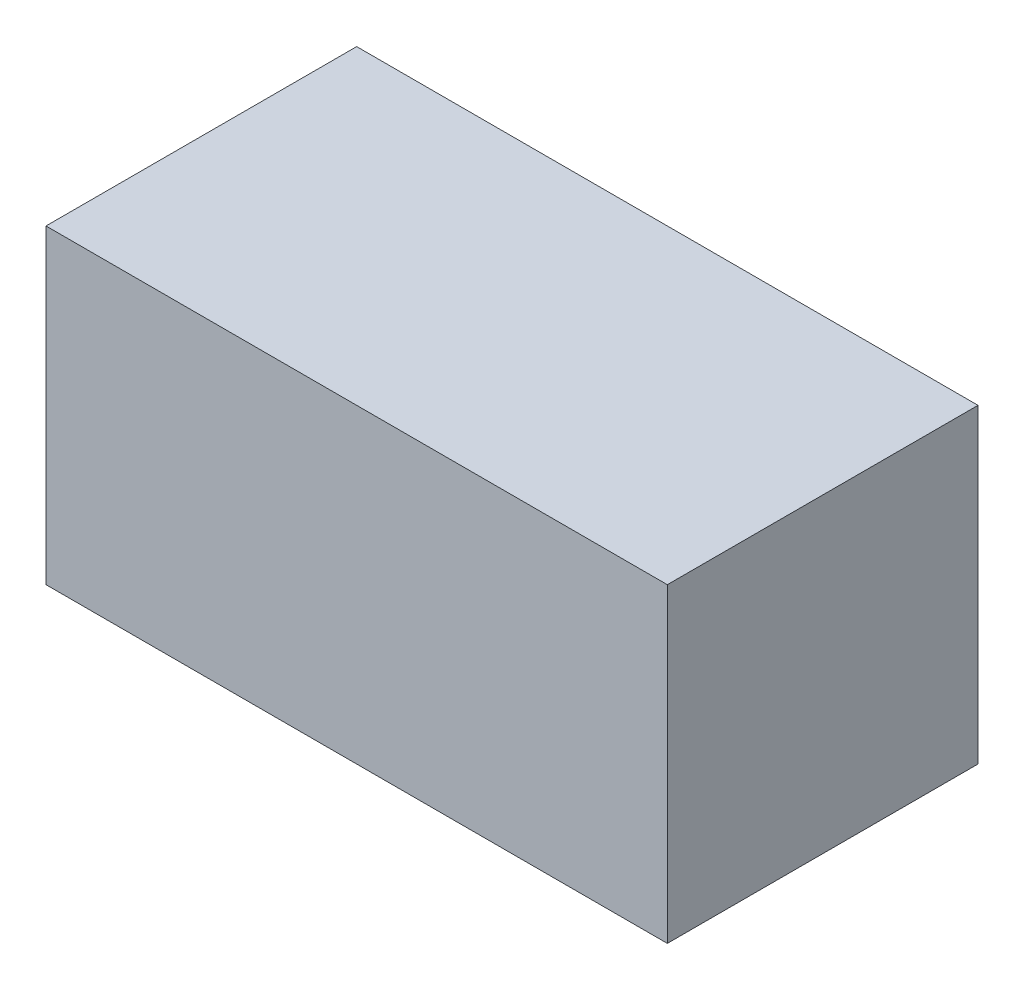
ISO-10303-21;
HEADER;
FILE_DESCRIPTION(('STEP AP214'),'2;1');
FILE_NAME('part.step','',(''),(''),'','','');
FILE_SCHEMA(('AUTOMOTIVE_DESIGN { 1 0 10303 214 1 1 1 1 }'));
ENDSEC;
DATA;
#1=APPLICATION_CONTEXT('core data for automotive mechanical design processes');
#2=APPLICATION_PROTOCOL_DEFINITION('international standard','automotive_design',2000,#1);
#3=PRODUCT_CONTEXT('',#1,'mechanical');
#4=PRODUCT('Part','Part','',(#3));
#5=PRODUCT_RELATED_PRODUCT_CATEGORY('part','',(#4));
#6=PRODUCT_DEFINITION_FORMATION('','',#4);
#7=PRODUCT_DEFINITION_CONTEXT('part definition',#1,'design');
#8=PRODUCT_DEFINITION('design','',#6,#7);
#9=PRODUCT_DEFINITION_SHAPE('','',#8);
#10=(LENGTH_UNIT() NAMED_UNIT(*) SI_UNIT(.MILLI.,.METRE.));
#11=(NAMED_UNIT(*) PLANE_ANGLE_UNIT() SI_UNIT($,.RADIAN.));
#12=(NAMED_UNIT(*) SI_UNIT($,.STERADIAN.) SOLID_ANGLE_UNIT());
#13=UNCERTAINTY_MEASURE_WITH_UNIT(LENGTH_MEASURE(1.E-05),#10,'distance_accuracy_value','');
#14=(GEOMETRIC_REPRESENTATION_CONTEXT(3) GLOBAL_UNCERTAINTY_ASSIGNED_CONTEXT((#13)) GLOBAL_UNIT_ASSIGNED_CONTEXT((#10,
#11,#12)) REPRESENTATION_CONTEXT('',''));
#15=CARTESIAN_POINT('',(0.,0.,0.));
#16=DIRECTION('',(0.,0.,1.));
#17=DIRECTION('',(1.,0.,0.));
#18=AXIS2_PLACEMENT_3D('',#15,#16,#17);
#19=CARTESIAN_POINT('',(2300.,-1450.,350.));
#20=DIRECTION('',(0.,-1.,0.));
#21=DIRECTION('',(0.,0.,-1.));
#22=AXIS2_PLACEMENT_3D('',#19,#20,#21);
#23=PLANE('',#22);
#24=DIRECTION('',(-1.,0.,0.));
#25=VECTOR('',#24,1.);
#26=CARTESIAN_POINT('',(2300.,-1450.,0.));
#27=LINE('',#26,#25);
#28=CARTESIAN_POINT('',(2300.,-1450.,0.));
#29=VERTEX_POINT('',#28);
#30=CARTESIAN_POINT('',(1600.,-1450.,0.));
#31=VERTEX_POINT('',#30);
#32=EDGE_CURVE('E105',#29,#31,#27,.T.);
#33=ORIENTED_EDGE('',*,*,#32,.T.);
#34=DIRECTION('',(0.,0.,-1.));
#35=VECTOR('',#34,1.);
#36=CARTESIAN_POINT('',(1600.,-1450.,350.));
#37=LINE('',#36,#35);
#38=CARTESIAN_POINT('',(1600.,-1450.,350.));
#39=VERTEX_POINT('',#38);
#40=EDGE_CURVE('E11',#39,#31,#37,.T.);
#41=ORIENTED_EDGE('',*,*,#40,.F.);
#42=DIRECTION('',(-1.,0.,0.));
#43=VECTOR('',#42,1.);
#44=CARTESIAN_POINT('',(2300.,-1450.,350.));
#45=LINE('',#44,#43);
#46=CARTESIAN_POINT('',(2300.,-1450.,350.));
#47=VERTEX_POINT('',#46);
#48=EDGE_CURVE('E89',#47,#39,#45,.T.);
#49=ORIENTED_EDGE('',*,*,#48,.F.);
#50=DIRECTION('',(0.,0.,-1.));
#51=VECTOR('',#50,1.);
#52=CARTESIAN_POINT('',(2300.,-1450.,350.));
#53=LINE('',#52,#51);
#54=EDGE_CURVE('E97',#47,#29,#53,.T.);
#55=ORIENTED_EDGE('',*,*,#54,.T.);
#56=EDGE_LOOP('',(#33,#41,#49,#55));
#57=FACE_BOUND('',#56,.T.);
#58=ADVANCED_FACE('F39',(#57),#23,.F.);
#59=CARTESIAN_POINT('',(1600.,-1450.,350.));
#60=DIRECTION('',(1.,0.,0.));
#61=DIRECTION('',(0.,0.,-1.));
#62=AXIS2_PLACEMENT_3D('',#59,#60,#61);
#63=PLANE('',#62);
#64=DIRECTION('',(0.,-1.,0.));
#65=VECTOR('',#64,1.);
#66=CARTESIAN_POINT('',(1600.,-1450.,0.));
#67=LINE('',#66,#65);
#68=CARTESIAN_POINT('',(1600.,-1800.,0.));
#69=VERTEX_POINT('',#68);
#70=EDGE_CURVE('E92',#31,#69,#67,.T.);
#71=ORIENTED_EDGE('',*,*,#70,.T.);
#72=DIRECTION('',(0.,0.,-1.));
#73=VECTOR('',#72,1.);
#74=CARTESIAN_POINT('',(1600.,-1800.,350.));
#75=LINE('',#74,#73);
#76=CARTESIAN_POINT('',(1600.,-1800.,350.));
#77=VERTEX_POINT('',#76);
#78=EDGE_CURVE('E50',#77,#69,#75,.T.);
#79=ORIENTED_EDGE('',*,*,#78,.F.);
#80=DIRECTION('',(0.,-1.,0.));
#81=VECTOR('',#80,1.);
#82=CARTESIAN_POINT('',(1600.,-1450.,350.));
#83=LINE('',#82,#81);
#84=EDGE_CURVE('E82',#39,#77,#83,.T.);
#85=ORIENTED_EDGE('',*,*,#84,.F.);
#86=ORIENTED_EDGE('',*,*,#40,.T.);
#87=EDGE_LOOP('',(#71,#79,#85,#86));
#88=FACE_BOUND('',#87,.T.);
#89=ADVANCED_FACE('F93',(#88),#63,.F.);
#90=CARTESIAN_POINT('',(1600.,-1800.,350.));
#91=DIRECTION('',(0.,1.,0.));
#92=DIRECTION('',(0.,0.,1.));
#93=AXIS2_PLACEMENT_3D('',#90,#91,#92);
#94=PLANE('',#93);
#95=DIRECTION('',(1.,0.,0.));
#96=VECTOR('',#95,1.);
#97=CARTESIAN_POINT('',(1600.,-1800.,0.));
#98=LINE('',#97,#96);
#99=CARTESIAN_POINT('',(2300.,-1800.,0.));
#100=VERTEX_POINT('',#99);
#101=EDGE_CURVE('E72',#69,#100,#98,.T.);
#102=ORIENTED_EDGE('',*,*,#101,.T.);
#103=DIRECTION('',(0.,0.,-1.));
#104=VECTOR('',#103,1.);
#105=CARTESIAN_POINT('',(2300.,-1800.,350.));
#106=LINE('',#105,#104);
#107=CARTESIAN_POINT('',(2300.,-1800.,350.));
#108=VERTEX_POINT('',#107);
#109=EDGE_CURVE('E94',#108,#100,#106,.T.);
#110=ORIENTED_EDGE('',*,*,#109,.F.);
#111=DIRECTION('',(1.,0.,0.));
#112=VECTOR('',#111,1.);
#113=CARTESIAN_POINT('',(1600.,-1800.,350.));
#114=LINE('',#113,#112);
#115=EDGE_CURVE('E88',#77,#108,#114,.T.);
#116=ORIENTED_EDGE('',*,*,#115,.F.);
#117=ORIENTED_EDGE('',*,*,#78,.T.);
#118=EDGE_LOOP('',(#102,#110,#116,#117));
#119=FACE_BOUND('',#118,.T.);
#120=ADVANCED_FACE('F96',(#119),#94,.F.);
#121=CARTESIAN_POINT('',(2300.,-1800.,350.));
#122=DIRECTION('',(-1.,0.,0.));
#123=DIRECTION('',(0.,0.,1.));
#124=AXIS2_PLACEMENT_3D('',#121,#122,#123);
#125=PLANE('',#124);
#126=DIRECTION('',(0.,1.,0.));
#127=VECTOR('',#126,1.);
#128=CARTESIAN_POINT('',(2300.,-1800.,0.));
#129=LINE('',#128,#127);
#130=EDGE_CURVE('E76',#100,#29,#129,.T.);
#131=ORIENTED_EDGE('',*,*,#130,.T.);
#132=ORIENTED_EDGE('',*,*,#54,.F.);
#133=DIRECTION('',(0.,1.,0.));
#134=VECTOR('',#133,1.);
#135=CARTESIAN_POINT('',(2300.,-1800.,350.));
#136=LINE('',#135,#134);
#137=EDGE_CURVE('E54',#108,#47,#136,.T.);
#138=ORIENTED_EDGE('',*,*,#137,.F.);
#139=ORIENTED_EDGE('',*,*,#109,.T.);
#140=EDGE_LOOP('',(#131,#132,#138,#139));
#141=FACE_BOUND('',#140,.T.);
#142=ADVANCED_FACE('F108',(#141),#125,.F.);
#143=CARTESIAN_POINT('',(0.,0.,350.));
#144=DIRECTION('',(0.,0.,1.));
#145=DIRECTION('',(1.,0.,0.));
#146=AXIS2_PLACEMENT_3D('',#143,#144,#145);
#147=PLANE('',#146);
#148=ORIENTED_EDGE('',*,*,#48,.T.);
#149=ORIENTED_EDGE('',*,*,#84,.T.);
#150=ORIENTED_EDGE('',*,*,#115,.T.);
#151=ORIENTED_EDGE('',*,*,#137,.T.);
#152=EDGE_LOOP('',(#148,#149,#150,#151));
#153=FACE_BOUND('',#152,.T.);
#154=ADVANCED_FACE('F86',(#153),#147,.T.);
#155=CARTESIAN_POINT('',(0.,0.,0.));
#156=DIRECTION('',(0.,0.,1.));
#157=DIRECTION('',(1.,0.,0.));
#158=AXIS2_PLACEMENT_3D('',#155,#156,#157);
#159=PLANE('',#158);
#160=ORIENTED_EDGE('',*,*,#32,.F.);
#161=ORIENTED_EDGE('',*,*,#130,.F.);
#162=ORIENTED_EDGE('',*,*,#101,.F.);
#163=ORIENTED_EDGE('',*,*,#70,.F.);
#164=EDGE_LOOP('',(#160,#161,#162,#163));
#165=FACE_BOUND('',#164,.T.);
#166=ADVANCED_FACE('F115',(#165),#159,.F.);
#167=CLOSED_SHELL('',(#58,#89,#120,#142,#154,#166));
#168=MANIFOLD_SOLID_BREP('B2',#167);
#169=ADVANCED_BREP_SHAPE_REPRESENTATION('',(#18,#168),#14);
#170=SHAPE_DEFINITION_REPRESENTATION(#9,#169);
ENDSEC;
END-ISO-10303-21;
